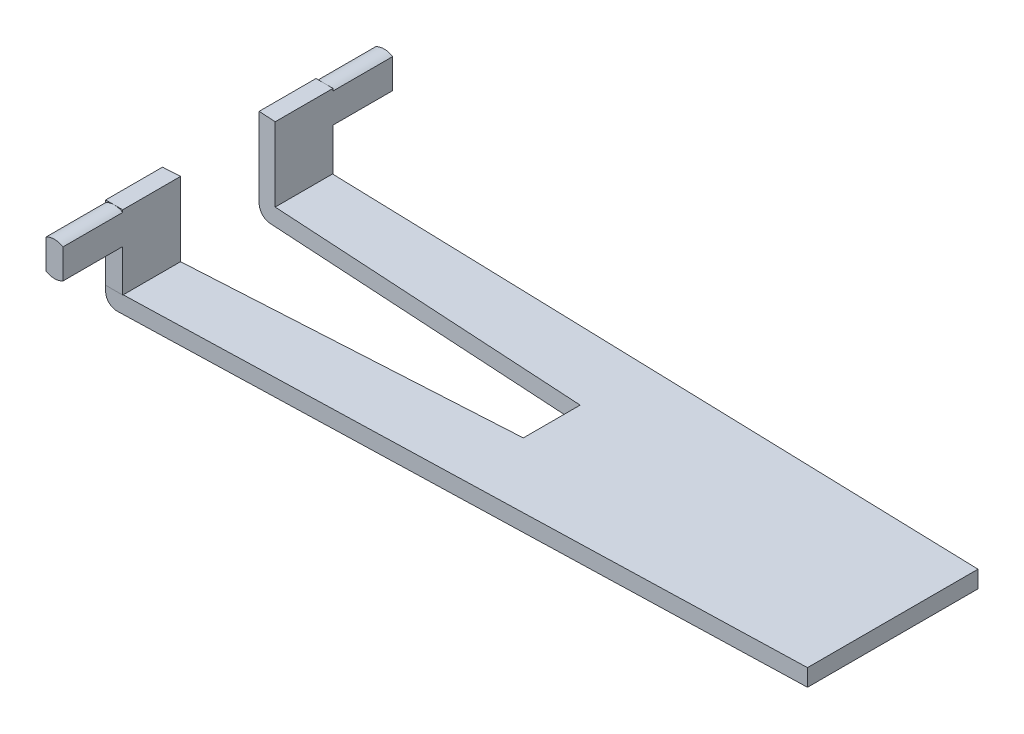
ISO-10303-21;
HEADER;
FILE_DESCRIPTION(('STEP AP214'),'2;1');
FILE_NAME('part.step','',(''),(''),'','','');
FILE_SCHEMA(('AUTOMOTIVE_DESIGN { 1 0 10303 214 1 1 1 1 }'));
ENDSEC;
DATA;
#1=APPLICATION_CONTEXT('core data for automotive mechanical design processes');
#2=APPLICATION_PROTOCOL_DEFINITION('international standard','automotive_design',2000,#1);
#3=PRODUCT_CONTEXT('',#1,'mechanical');
#4=PRODUCT('Part','Part','',(#3));
#5=PRODUCT_RELATED_PRODUCT_CATEGORY('part','',(#4));
#6=PRODUCT_DEFINITION_FORMATION('','',#4);
#7=PRODUCT_DEFINITION_CONTEXT('part definition',#1,'design');
#8=PRODUCT_DEFINITION('design','',#6,#7);
#9=PRODUCT_DEFINITION_SHAPE('','',#8);
#10=(LENGTH_UNIT() NAMED_UNIT(*) SI_UNIT(.MILLI.,.METRE.));
#11=(NAMED_UNIT(*) PLANE_ANGLE_UNIT() SI_UNIT($,.RADIAN.));
#12=(NAMED_UNIT(*) SI_UNIT($,.STERADIAN.) SOLID_ANGLE_UNIT());
#13=UNCERTAINTY_MEASURE_WITH_UNIT(LENGTH_MEASURE(1.E-05),#10,'distance_accuracy_value','');
#14=(GEOMETRIC_REPRESENTATION_CONTEXT(3) GLOBAL_UNCERTAINTY_ASSIGNED_CONTEXT((#13)) GLOBAL_UNIT_ASSIGNED_CONTEXT((#10,
#11,#12)) REPRESENTATION_CONTEXT('',''));
#15=CARTESIAN_POINT('',(0.,0.,0.));
#16=DIRECTION('',(0.,0.,1.));
#17=DIRECTION('',(1.,0.,0.));
#18=AXIS2_PLACEMENT_3D('',#15,#16,#17);
#19=CARTESIAN_POINT('',(-6.,0.3,1.84763326978969));
#20=DIRECTION('',(1.,0.,0.));
#21=DIRECTION('',(0.,0.,-1.));
#22=AXIS2_PLACEMENT_3D('',#19,#20,#21);
#23=PLANE('',#22);
#24=DIRECTION('',(0.,0.,1.));
#25=VECTOR('',#24,1.);
#26=CARTESIAN_POINT('',(-6.,1.55980762113533,1.84763326978969));
#27=LINE('',#26,#25);
#28=CARTESIAN_POINT('',(-6.,1.55980762113533,1.84763326978969));
#29=VERTEX_POINT('',#28);
#30=CARTESIAN_POINT('',(-6.,1.55980762113533,2.89763326978969));
#31=VERTEX_POINT('',#30);
#32=EDGE_CURVE('E221',#29,#31,#27,.T.);
#33=ORIENTED_EDGE('',*,*,#32,.F.);
#34=DIRECTION('',(0.,-1.,0.));
#35=VECTOR('',#34,1.);
#36=CARTESIAN_POINT('',(-6.,0.3,1.84763326978969));
#37=LINE('',#36,#35);
#38=CARTESIAN_POINT('',(-6.,1.6,1.84763326978969));
#39=VERTEX_POINT('',#38);
#40=EDGE_CURVE('E205',#39,#29,#37,.T.);
#41=ORIENTED_EDGE('',*,*,#40,.F.);
#42=DIRECTION('',(0.,0.,1.));
#43=VECTOR('',#42,1.);
#44=CARTESIAN_POINT('',(-6.,1.6,0.847633269789688));
#45=LINE('',#44,#43);
#46=CARTESIAN_POINT('',(-6.,1.6,0.847633269789688));
#47=VERTEX_POINT('',#46);
#48=EDGE_CURVE('E284',#47,#39,#45,.T.);
#49=ORIENTED_EDGE('',*,*,#48,.F.);
#50=DIRECTION('',(0.,-1.,0.));
#51=VECTOR('',#50,1.);
#52=CARTESIAN_POINT('',(-6.,0.3,0.847633269789688));
#53=LINE('',#52,#51);
#54=CARTESIAN_POINT('',(-6.,0.2,0.847633269789688));
#55=VERTEX_POINT('',#54);
#56=EDGE_CURVE('E361',#47,#55,#53,.T.);
#57=ORIENTED_EDGE('',*,*,#56,.T.);
#58=DIRECTION('',(0.,0.,1.));
#59=VECTOR('',#58,1.);
#60=CARTESIAN_POINT('',(-6.,0.2,1.84763326978969));
#61=LINE('',#60,#59);
#62=CARTESIAN_POINT('',(-6.,0.2,1.84763326978969));
#63=VERTEX_POINT('',#62);
#64=EDGE_CURVE('E371',#55,#63,#61,.T.);
#65=ORIENTED_EDGE('',*,*,#64,.T.);
#66=DIRECTION('',(0.,-1.,0.));
#67=VECTOR('',#66,1.);
#68=CARTESIAN_POINT('',(-6.,0.3,1.84763326978969));
#69=LINE('',#68,#67);
#70=CARTESIAN_POINT('',(-6.,0.3,1.84763326978969));
#71=VERTEX_POINT('',#70);
#72=EDGE_CURVE('E358',#71,#63,#69,.T.);
#73=ORIENTED_EDGE('',*,*,#72,.F.);
#74=DIRECTION('',(0.,-1.,0.));
#75=VECTOR('',#74,1.);
#76=CARTESIAN_POINT('',(-6.,0.3,1.84763326978969));
#77=LINE('',#76,#75);
#78=CARTESIAN_POINT('',(-6.,1.04019237886467,1.84763326978969));
#79=VERTEX_POINT('',#78);
#80=EDGE_CURVE('E268',#79,#71,#77,.T.);
#81=ORIENTED_EDGE('',*,*,#80,.F.);
#82=DIRECTION('',(0.,0.,1.));
#83=VECTOR('',#82,1.);
#84=CARTESIAN_POINT('',(-6.,1.04019237886467,1.84763326978969));
#85=LINE('',#84,#83);
#86=CARTESIAN_POINT('',(-6.,1.04019237886467,2.89763326978969));
#87=VERTEX_POINT('',#86);
#88=EDGE_CURVE('E229',#79,#87,#85,.T.);
#89=ORIENTED_EDGE('',*,*,#88,.T.);
#90=DIRECTION('',(0.,-1.,0.));
#91=VECTOR('',#90,1.);
#92=CARTESIAN_POINT('',(-6.,1.6,2.89763326978969));
#93=LINE('',#92,#91);
#94=EDGE_CURVE('E228',#31,#87,#93,.T.);
#95=ORIENTED_EDGE('',*,*,#94,.F.);
#96=EDGE_LOOP('',(#33,#41,#49,#57,#65,#73,#81,#89,#95));
#97=FACE_BOUND('',#96,.T.);
#98=ADVANCED_FACE('F37',(#97),#23,.F.);
#99=CARTESIAN_POINT('',(-6.,1.6,2.89763326978969));
#100=DIRECTION('',(0.,0.,-1.));
#101=DIRECTION('',(-1.,0.,0.));
#102=AXIS2_PLACEMENT_3D('',#99,#100,#101);
#103=PLANE('',#102);
#104=CARTESIAN_POINT('',(-5.85,1.3,2.89763326978969));
#105=DIRECTION('',(0.,0.,1.));
#106=DIRECTION('',(1.,0.,0.));
#107=AXIS2_PLACEMENT_3D('',#104,#105,#106);
#108=CIRCLE('',#107,0.3);
#109=CARTESIAN_POINT('',(-5.7,1.55980762113533,2.89763326978969));
#110=VERTEX_POINT('',#109);
#111=EDGE_CURVE('E446',#110,#31,#108,.T.);
#112=ORIENTED_EDGE('',*,*,#111,.T.);
#113=ORIENTED_EDGE('',*,*,#94,.T.);
#114=CARTESIAN_POINT('',(-5.85,1.3,2.89763326978969));
#115=DIRECTION('',(0.,0.,1.));
#116=DIRECTION('',(1.,0.,0.));
#117=AXIS2_PLACEMENT_3D('',#114,#115,#116);
#118=CIRCLE('',#117,0.3);
#119=CARTESIAN_POINT('',(-5.7,1.04019237886467,2.89763326978969));
#120=VERTEX_POINT('',#119);
#121=EDGE_CURVE('E224',#87,#120,#118,.T.);
#122=ORIENTED_EDGE('',*,*,#121,.T.);
#123=DIRECTION('',(0.,-1.,0.));
#124=VECTOR('',#123,1.);
#125=CARTESIAN_POINT('',(-5.7,1.6,2.89763326978969));
#126=LINE('',#125,#124);
#127=EDGE_CURVE('E294',#110,#120,#126,.T.);
#128=ORIENTED_EDGE('',*,*,#127,.F.);
#129=EDGE_LOOP('',(#112,#113,#122,#128));
#130=FACE_BOUND('',#129,.T.);
#131=ADVANCED_FACE('F445',(#130),#103,.F.);
#132=CARTESIAN_POINT('',(-5.7,1.6,2.89763326978969));
#133=DIRECTION('',(-1.,0.,0.));
#134=DIRECTION('',(0.,0.,1.));
#135=AXIS2_PLACEMENT_3D('',#132,#133,#134);
#136=PLANE('',#135);
#137=DIRECTION('',(0.,0.,1.));
#138=VECTOR('',#137,1.);
#139=CARTESIAN_POINT('',(-5.7,1.55980762113533,1.84763326978969));
#140=LINE('',#139,#138);
#141=CARTESIAN_POINT('',(-5.7,1.55980762113533,1.84763326978969));
#142=VERTEX_POINT('',#141);
#143=EDGE_CURVE('E241',#142,#110,#140,.T.);
#144=ORIENTED_EDGE('',*,*,#143,.T.);
#145=ORIENTED_EDGE('',*,*,#127,.T.);
#146=DIRECTION('',(0.,0.,1.));
#147=VECTOR('',#146,1.);
#148=CARTESIAN_POINT('',(-5.7,1.04019237886467,1.84763326978969));
#149=LINE('',#148,#147);
#150=CARTESIAN_POINT('',(-5.7,1.04019237886467,1.84763326978969));
#151=VERTEX_POINT('',#150);
#152=EDGE_CURVE('E232',#151,#120,#149,.T.);
#153=ORIENTED_EDGE('',*,*,#152,.F.);
#154=DIRECTION('',(0.,-1.,0.));
#155=VECTOR('',#154,1.);
#156=CARTESIAN_POINT('',(-5.7,0.3,1.84763326978969));
#157=LINE('',#156,#155);
#158=CARTESIAN_POINT('',(-5.7,0.3,1.84763326978969));
#159=VERTEX_POINT('',#158);
#160=EDGE_CURVE('E270',#151,#159,#157,.T.);
#161=ORIENTED_EDGE('',*,*,#160,.T.);
#162=DIRECTION('',(0.,0.,-1.));
#163=VECTOR('',#162,1.);
#164=CARTESIAN_POINT('',(-5.7,0.3,2.89763326978969));
#165=LINE('',#164,#163);
#166=CARTESIAN_POINT('',(-5.7,0.3,1.83894243804495));
#167=VERTEX_POINT('',#166);
#168=EDGE_CURVE('E285',#159,#167,#165,.T.);
#169=ORIENTED_EDGE('',*,*,#168,.T.);
#170=CARTESIAN_POINT('',(-5.7,0.3,0.830251606300204));
#171=VERTEX_POINT('',#170);
#172=EDGE_CURVE('E291',#167,#171,#165,.T.);
#173=ORIENTED_EDGE('',*,*,#172,.T.);
#174=DIRECTION('',(0.,-1.,0.));
#175=VECTOR('',#174,1.);
#176=CARTESIAN_POINT('',(-5.7,1.6,0.830251606300204));
#177=LINE('',#176,#175);
#178=CARTESIAN_POINT('',(-5.7,1.6,0.830251606300204));
#179=VERTEX_POINT('',#178);
#180=EDGE_CURVE('E289',#179,#171,#177,.T.);
#181=ORIENTED_EDGE('',*,*,#180,.F.);
#182=DIRECTION('',(0.,0.,-1.));
#183=VECTOR('',#182,1.);
#184=CARTESIAN_POINT('',(-5.7,1.6,2.89763326978969));
#185=LINE('',#184,#183);
#186=CARTESIAN_POINT('',(-5.7,1.6,1.84763326978969));
#187=VERTEX_POINT('',#186);
#188=EDGE_CURVE('E287',#187,#179,#185,.T.);
#189=ORIENTED_EDGE('',*,*,#188,.F.);
#190=DIRECTION('',(0.,1.,0.));
#191=VECTOR('',#190,1.);
#192=CARTESIAN_POINT('',(-5.7,1.6,1.84763326978969));
#193=LINE('',#192,#191);
#194=EDGE_CURVE('E52',#142,#187,#193,.T.);
#195=ORIENTED_EDGE('',*,*,#194,.F.);
#196=EDGE_LOOP('',(#144,#145,#153,#161,#169,#173,#181,#189,#195));
#197=FACE_BOUND('',#196,.T.);
#198=ADVANCED_FACE('F428',(#197),#136,.F.);
#199=CARTESIAN_POINT('',(0.,1.6,0.));
#200=DIRECTION('',(0.,1.,0.));
#201=DIRECTION('',(0.,0.,1.));
#202=AXIS2_PLACEMENT_3D('',#199,#200,#201);
#203=PLANE('',#202);
#204=ORIENTED_EDGE('',*,*,#48,.T.);
#205=DIRECTION('',(1.,0.,0.));
#206=VECTOR('',#205,1.);
#207=CARTESIAN_POINT('',(0.,1.6,1.84763326978969));
#208=LINE('',#207,#206);
#209=CARTESIAN_POINT('',(-5.85,1.6,1.84763326978969));
#210=VERTEX_POINT('',#209);
#211=EDGE_CURVE('E211',#39,#210,#208,.T.);
#212=ORIENTED_EDGE('',*,*,#211,.T.);
#213=EDGE_CURVE('E239',#210,#187,#208,.T.);
#214=ORIENTED_EDGE('',*,*,#213,.T.);
#215=ORIENTED_EDGE('',*,*,#188,.T.);
#216=DIRECTION('',(-0.998325757229834,0.,0.0578418745501789));
#217=VECTOR('',#216,1.);
#218=CARTESIAN_POINT('',(-5.7,1.6,0.830251606300204));
#219=LINE('',#218,#217);
#220=EDGE_CURVE('E281',#179,#47,#219,.T.);
#221=ORIENTED_EDGE('',*,*,#220,.T.);
#222=EDGE_LOOP('',(#204,#212,#214,#215,#221));
#223=FACE_BOUND('',#222,.T.);
#224=ADVANCED_FACE('F440',(#223),#203,.T.);
#225=CARTESIAN_POINT('',(-6.,0.3,-0.852366730210312));
#226=DIRECTION('',(1.,0.,0.));
#227=DIRECTION('',(0.,0.,-1.));
#228=AXIS2_PLACEMENT_3D('',#225,#226,#227);
#229=PLANE('',#228);
#230=DIRECTION('',(0.,0.,-1.));
#231=VECTOR('',#230,1.);
#232=CARTESIAN_POINT('',(-6.,1.55980762113533,-1.85236673021031));
#233=LINE('',#232,#231);
#234=CARTESIAN_POINT('',(-6.,1.55980762113533,-1.85236673021031));
#235=VERTEX_POINT('',#234);
#236=CARTESIAN_POINT('',(-6.,1.55980762113533,-2.90236673021031));
#237=VERTEX_POINT('',#236);
#238=EDGE_CURVE('E251',#235,#237,#233,.T.);
#239=ORIENTED_EDGE('',*,*,#238,.T.);
#240=DIRECTION('',(0.,-1.,0.));
#241=VECTOR('',#240,1.);
#242=CARTESIAN_POINT('',(-6.,1.6,-2.90236673021031));
#243=LINE('',#242,#241);
#244=CARTESIAN_POINT('',(-6.,1.04019237886467,-2.90236673021031));
#245=VERTEX_POINT('',#244);
#246=EDGE_CURVE('E308',#237,#245,#243,.T.);
#247=ORIENTED_EDGE('',*,*,#246,.T.);
#248=DIRECTION('',(0.,0.,-1.));
#249=VECTOR('',#248,1.);
#250=CARTESIAN_POINT('',(-6.,1.04019237886467,-1.85236673021031));
#251=LINE('',#250,#249);
#252=CARTESIAN_POINT('',(-6.,1.04019237886467,-1.85236673021031));
#253=VERTEX_POINT('',#252);
#254=EDGE_CURVE('E255',#253,#245,#251,.T.);
#255=ORIENTED_EDGE('',*,*,#254,.F.);
#256=DIRECTION('',(0.,1.,0.));
#257=VECTOR('',#256,1.);
#258=CARTESIAN_POINT('',(-6.,0.3,-1.85236673021031));
#259=LINE('',#258,#257);
#260=CARTESIAN_POINT('',(-6.,0.3,-1.85236673021031));
#261=VERTEX_POINT('',#260);
#262=EDGE_CURVE('E277',#261,#253,#259,.T.);
#263=ORIENTED_EDGE('',*,*,#262,.F.);
#264=DIRECTION('',(0.,-1.,0.));
#265=VECTOR('',#264,1.);
#266=CARTESIAN_POINT('',(-6.,0.3,-1.85236673021031));
#267=LINE('',#266,#265);
#268=CARTESIAN_POINT('',(-6.,0.2,-1.85236673021031));
#269=VERTEX_POINT('',#268);
#270=EDGE_CURVE('E333',#261,#269,#267,.T.);
#271=ORIENTED_EDGE('',*,*,#270,.T.);
#272=DIRECTION('',(0.,0.,1.));
#273=VECTOR('',#272,1.);
#274=CARTESIAN_POINT('',(-6.,0.2,-0.852366730210312));
#275=LINE('',#274,#273);
#276=CARTESIAN_POINT('',(-6.,0.2,-0.852366730210312));
#277=VERTEX_POINT('',#276);
#278=EDGE_CURVE('E391',#269,#277,#275,.T.);
#279=ORIENTED_EDGE('',*,*,#278,.T.);
#280=DIRECTION('',(0.,-1.,0.));
#281=VECTOR('',#280,1.);
#282=CARTESIAN_POINT('',(-6.,0.3,-0.852366730210312));
#283=LINE('',#282,#281);
#284=CARTESIAN_POINT('',(-6.,1.6,-0.852366730210312));
#285=VERTEX_POINT('',#284);
#286=EDGE_CURVE('E369',#285,#277,#283,.T.);
#287=ORIENTED_EDGE('',*,*,#286,.F.);
#288=DIRECTION('',(0.,0.,1.));
#289=VECTOR('',#288,1.);
#290=CARTESIAN_POINT('',(-6.,1.6,-0.852366730210312));
#291=LINE('',#290,#289);
#292=CARTESIAN_POINT('',(-6.,1.6,-1.85236673021031));
#293=VERTEX_POINT('',#292);
#294=EDGE_CURVE('E306',#293,#285,#291,.T.);
#295=ORIENTED_EDGE('',*,*,#294,.F.);
#296=DIRECTION('',(0.,1.,0.));
#297=VECTOR('',#296,1.);
#298=CARTESIAN_POINT('',(-6.,0.3,-1.85236673021031));
#299=LINE('',#298,#297);
#300=EDGE_CURVE('E265',#235,#293,#299,.T.);
#301=ORIENTED_EDGE('',*,*,#300,.F.);
#302=EDGE_LOOP('',(#239,#247,#255,#263,#271,#279,#287,#295,#301));
#303=FACE_BOUND('',#302,.T.);
#304=ADVANCED_FACE('F413',(#303),#229,.F.);
#305=CARTESIAN_POINT('',(-5.7,1.6,-2.90236673021031));
#306=DIRECTION('',(-1.,0.,0.));
#307=DIRECTION('',(0.,0.,1.));
#308=AXIS2_PLACEMENT_3D('',#305,#306,#307);
#309=PLANE('',#308);
#310=DIRECTION('',(0.,0.,-1.));
#311=VECTOR('',#310,1.);
#312=CARTESIAN_POINT('',(-5.7,1.55980762113533,-1.85236673021031));
#313=LINE('',#312,#311);
#314=CARTESIAN_POINT('',(-5.7,1.55980762113533,-1.85236673021031));
#315=VERTEX_POINT('',#314);
#316=CARTESIAN_POINT('',(-5.7,1.55980762113533,-2.90236673021031));
#317=VERTEX_POINT('',#316);
#318=EDGE_CURVE('E247',#315,#317,#313,.T.);
#319=ORIENTED_EDGE('',*,*,#318,.F.);
#320=DIRECTION('',(0.,-1.,0.));
#321=VECTOR('',#320,1.);
#322=CARTESIAN_POINT('',(-5.7,1.6,-1.85236673021031));
#323=LINE('',#322,#321);
#324=CARTESIAN_POINT('',(-5.7,1.6,-1.85236673021031));
#325=VERTEX_POINT('',#324);
#326=EDGE_CURVE('E263',#325,#315,#323,.T.);
#327=ORIENTED_EDGE('',*,*,#326,.F.);
#328=DIRECTION('',(0.,0.,-1.));
#329=VECTOR('',#328,1.);
#330=CARTESIAN_POINT('',(-5.7,1.6,-2.90236673021031));
#331=LINE('',#330,#329);
#332=CARTESIAN_POINT('',(-5.7,1.6,-0.834748393699796));
#333=VERTEX_POINT('',#332);
#334=EDGE_CURVE('E302',#333,#325,#331,.T.);
#335=ORIENTED_EDGE('',*,*,#334,.F.);
#336=DIRECTION('',(0.,-1.,0.));
#337=VECTOR('',#336,1.);
#338=CARTESIAN_POINT('',(-5.7,1.6,-0.834748393699796));
#339=LINE('',#338,#337);
#340=CARTESIAN_POINT('',(-5.7,0.3,-0.834748393699796));
#341=VERTEX_POINT('',#340);
#342=EDGE_CURVE('E320',#333,#341,#339,.T.);
#343=ORIENTED_EDGE('',*,*,#342,.T.);
#344=DIRECTION('',(0.,0.,-1.));
#345=VECTOR('',#344,1.);
#346=CARTESIAN_POINT('',(-5.7,0.3,-2.90236673021031));
#347=LINE('',#346,#345);
#348=CARTESIAN_POINT('',(-5.7,0.3,-1.84355756195505));
#349=VERTEX_POINT('',#348);
#350=EDGE_CURVE('E303',#341,#349,#347,.T.);
#351=ORIENTED_EDGE('',*,*,#350,.T.);
#352=CARTESIAN_POINT('',(-5.7,0.3,-1.85236673021031));
#353=VERTEX_POINT('',#352);
#354=EDGE_CURVE('E298',#349,#353,#347,.T.);
#355=ORIENTED_EDGE('',*,*,#354,.T.);
#356=DIRECTION('',(0.,1.,0.));
#357=VECTOR('',#356,1.);
#358=CARTESIAN_POINT('',(-5.7,0.3,-1.85236673021031));
#359=LINE('',#358,#357);
#360=CARTESIAN_POINT('',(-5.7,1.04019237886467,-1.85236673021031));
#361=VERTEX_POINT('',#360);
#362=EDGE_CURVE('E278',#353,#361,#359,.T.);
#363=ORIENTED_EDGE('',*,*,#362,.T.);
#364=DIRECTION('',(0.,0.,-1.));
#365=VECTOR('',#364,1.);
#366=CARTESIAN_POINT('',(-5.7,1.04019237886467,-1.85236673021031));
#367=LINE('',#366,#365);
#368=CARTESIAN_POINT('',(-5.7,1.04019237886467,-2.90236673021031));
#369=VERTEX_POINT('',#368);
#370=EDGE_CURVE('E258',#361,#369,#367,.T.);
#371=ORIENTED_EDGE('',*,*,#370,.T.);
#372=DIRECTION('',(0.,-1.,0.));
#373=VECTOR('',#372,1.);
#374=CARTESIAN_POINT('',(-5.7,1.6,-2.90236673021031));
#375=LINE('',#374,#373);
#376=EDGE_CURVE('E324',#317,#369,#375,.T.);
#377=ORIENTED_EDGE('',*,*,#376,.F.);
#378=EDGE_LOOP('',(#319,#327,#335,#343,#351,#355,#363,#371,#377));
#379=FACE_BOUND('',#378,.T.);
#380=ADVANCED_FACE('F480',(#379),#309,.F.);
#381=CARTESIAN_POINT('',(-6.,1.6,-2.90236673021031));
#382=DIRECTION('',(0.,0.,1.));
#383=DIRECTION('',(1.,0.,0.));
#384=AXIS2_PLACEMENT_3D('',#381,#382,#383);
#385=PLANE('',#384);
#386=CARTESIAN_POINT('',(-5.85,1.3,-2.90236673021031));
#387=DIRECTION('',(0.,0.,-1.));
#388=DIRECTION('',(-1.,0.,0.));
#389=AXIS2_PLACEMENT_3D('',#386,#387,#388);
#390=CIRCLE('',#389,0.3);
#391=EDGE_CURVE('E216',#237,#317,#390,.T.);
#392=ORIENTED_EDGE('',*,*,#391,.T.);
#393=ORIENTED_EDGE('',*,*,#376,.T.);
#394=CARTESIAN_POINT('',(-5.85,1.3,-2.90236673021031));
#395=DIRECTION('',(0.,0.,-1.));
#396=DIRECTION('',(-1.,0.,0.));
#397=AXIS2_PLACEMENT_3D('',#394,#395,#396);
#398=CIRCLE('',#397,0.3);
#399=EDGE_CURVE('E249',#369,#245,#398,.T.);
#400=ORIENTED_EDGE('',*,*,#399,.T.);
#401=ORIENTED_EDGE('',*,*,#246,.F.);
#402=EDGE_LOOP('',(#392,#393,#400,#401));
#403=FACE_BOUND('',#402,.T.);
#404=ADVANCED_FACE('F470',(#403),#385,.F.);
#405=CARTESIAN_POINT('',(0.,1.6,0.));
#406=DIRECTION('',(0.,-1.,0.));
#407=DIRECTION('',(0.,0.,-1.));
#408=AXIS2_PLACEMENT_3D('',#405,#406,#407);
#409=PLANE('',#408);
#410=DIRECTION('',(1.,0.,0.));
#411=VECTOR('',#410,1.);
#412=CARTESIAN_POINT('',(0.,1.6,-1.85236673021031));
#413=LINE('',#412,#411);
#414=CARTESIAN_POINT('',(-5.85,1.6,-1.85236673021031));
#415=VERTEX_POINT('',#414);
#416=EDGE_CURVE('E266',#293,#415,#413,.T.);
#417=ORIENTED_EDGE('',*,*,#416,.F.);
#418=ORIENTED_EDGE('',*,*,#294,.T.);
#419=DIRECTION('',(0.998279971383672,0.,0.0586267748918176));
#420=VECTOR('',#419,1.);
#421=CARTESIAN_POINT('',(-5.7,1.6,-0.834748393699796));
#422=LINE('',#421,#420);
#423=EDGE_CURVE('E299',#285,#333,#422,.T.);
#424=ORIENTED_EDGE('',*,*,#423,.T.);
#425=ORIENTED_EDGE('',*,*,#334,.T.);
#426=EDGE_CURVE('E254',#415,#325,#413,.T.);
#427=ORIENTED_EDGE('',*,*,#426,.F.);
#428=EDGE_LOOP('',(#417,#418,#424,#425,#427));
#429=FACE_BOUND('',#428,.T.);
#430=ADVANCED_FACE('F534',(#429),#409,.F.);
#431=CARTESIAN_POINT('',(0.,0.3,0.));
#432=DIRECTION('',(0.,-1.,0.));
#433=DIRECTION('',(0.,0.,-1.));
#434=AXIS2_PLACEMENT_3D('',#431,#432,#433);
#435=PLANE('',#434);
#436=ORIENTED_EDGE('',*,*,#172,.F.);
#437=DIRECTION('',(0.999580649727236,0.,-0.0289572908069317));
#438=VECTOR('',#437,1.);
#439=CARTESIAN_POINT('',(-6.,0.3,1.84763326978969));
#440=LINE('',#439,#438);
#441=CARTESIAN_POINT('',(6.,0.3,1.5));
#442=VERTEX_POINT('',#441);
#443=EDGE_CURVE('E460',#167,#442,#440,.T.);
#444=ORIENTED_EDGE('',*,*,#443,.T.);
#445=DIRECTION('',(0.,0.,-1.));
#446=VECTOR('',#445,1.);
#447=CARTESIAN_POINT('',(6.,0.3,1.5));
#448=LINE('',#447,#446);
#449=CARTESIAN_POINT('',(6.,0.3,-1.5));
#450=VERTEX_POINT('',#449);
#451=EDGE_CURVE('E332',#442,#450,#448,.T.);
#452=ORIENTED_EDGE('',*,*,#451,.T.);
#453=DIRECTION('',(-0.999569159454568,0.,-0.0293512430280063));
#454=VECTOR('',#453,1.);
#455=CARTESIAN_POINT('',(-6.,0.3,-1.85236673021031));
#456=LINE('',#455,#454);
#457=EDGE_CURVE('E331',#450,#349,#456,.T.);
#458=ORIENTED_EDGE('',*,*,#457,.T.);
#459=ORIENTED_EDGE('',*,*,#350,.F.);
#460=DIRECTION('',(0.998279971383672,0.,0.058626774891818));
#461=VECTOR('',#460,1.);
#462=CARTESIAN_POINT('',(-6.,0.3,-0.852366730210312));
#463=LINE('',#462,#461);
#464=CARTESIAN_POINT('',(0.,0.3,-0.5));
#465=VERTEX_POINT('',#464);
#466=EDGE_CURVE('E317',#341,#465,#463,.T.);
#467=ORIENTED_EDGE('',*,*,#466,.T.);
#468=DIRECTION('',(0.,0.,1.));
#469=VECTOR('',#468,1.);
#470=CARTESIAN_POINT('',(0.,0.3,-0.5));
#471=LINE('',#470,#469);
#472=CARTESIAN_POINT('',(0.,0.3,0.5));
#473=VERTEX_POINT('',#472);
#474=EDGE_CURVE('E463',#465,#473,#471,.T.);
#475=ORIENTED_EDGE('',*,*,#474,.T.);
#476=DIRECTION('',(-0.998325757229834,0.,0.057841874550179));
#477=VECTOR('',#476,1.);
#478=CARTESIAN_POINT('',(0.,0.3,0.5));
#479=LINE('',#478,#477);
#480=EDGE_CURVE('E438',#473,#171,#479,.T.);
#481=ORIENTED_EDGE('',*,*,#480,.T.);
#482=EDGE_LOOP('',(#436,#444,#452,#458,#459,#467,#475,#481));
#483=FACE_BOUND('',#482,.T.);
#484=ADVANCED_FACE('F483',(#483),#435,.F.);
#485=CARTESIAN_POINT('',(-6.,0.3,-0.852366730210312));
#486=DIRECTION('',(0.058626774891818,0.,-0.998279971383672));
#487=DIRECTION('',(-0.998279971383672,0.,-0.058626774891818));
#488=AXIS2_PLACEMENT_3D('',#485,#486,#487);
#489=PLANE('',#488);
#490=ORIENTED_EDGE('',*,*,#286,.T.);
#491=CARTESIAN_POINT('',(-5.8,0.2,-0.840621172536635));
#492=DIRECTION('',(0.058626774891818,0.,-0.998279971383672));
#493=DIRECTION('',(-0.998279971383672,0.,-0.058626774891818));
#494=AXIS2_PLACEMENT_3D('',#491,#492,#493);
#495=ELLIPSE('',#494,0.200344598442448,0.2);
#496=CARTESIAN_POINT('',(-5.8,0.,-0.840621172536635));
#497=VERTEX_POINT('',#496);
#498=EDGE_CURVE('E45',#277,#497,#495,.F.);
#499=ORIENTED_EDGE('',*,*,#498,.T.);
#500=DIRECTION('',(0.998279971383672,0.,0.058626774891818));
#501=VECTOR('',#500,1.);
#502=CARTESIAN_POINT('',(-6.,0.,-0.852366730210312));
#503=LINE('',#502,#501);
#504=CARTESIAN_POINT('',(0.,0.,-0.5));
#505=VERTEX_POINT('',#504);
#506=EDGE_CURVE('E323',#497,#505,#503,.T.);
#507=ORIENTED_EDGE('',*,*,#506,.T.);
#508=DIRECTION('',(0.,-1.,0.));
#509=VECTOR('',#508,1.);
#510=CARTESIAN_POINT('',(0.,0.3,-0.5));
#511=LINE('',#510,#509);
#512=EDGE_CURVE('E367',#465,#505,#511,.T.);
#513=ORIENTED_EDGE('',*,*,#512,.F.);
#514=ORIENTED_EDGE('',*,*,#466,.F.);
#515=ORIENTED_EDGE('',*,*,#342,.F.);
#516=ORIENTED_EDGE('',*,*,#423,.F.);
#517=EDGE_LOOP('',(#490,#499,#507,#513,#514,#515,#516));
#518=FACE_BOUND('',#517,.T.);
#519=ADVANCED_FACE('F394',(#518),#489,.F.);
#520=CARTESIAN_POINT('',(0.,0.3,-0.5));
#521=DIRECTION('',(1.,0.,0.));
#522=DIRECTION('',(0.,0.,-1.));
#523=AXIS2_PLACEMENT_3D('',#520,#521,#522);
#524=PLANE('',#523);
#525=DIRECTION('',(0.,0.,1.));
#526=VECTOR('',#525,1.);
#527=CARTESIAN_POINT('',(0.,0.,-0.5));
#528=LINE('',#527,#526);
#529=CARTESIAN_POINT('',(0.,0.,0.5));
#530=VERTEX_POINT('',#529);
#531=EDGE_CURVE('E340',#505,#530,#528,.T.);
#532=ORIENTED_EDGE('',*,*,#531,.T.);
#533=DIRECTION('',(0.,-1.,0.));
#534=VECTOR('',#533,1.);
#535=CARTESIAN_POINT('',(0.,0.3,0.5));
#536=LINE('',#535,#534);
#537=EDGE_CURVE('E364',#473,#530,#536,.T.);
#538=ORIENTED_EDGE('',*,*,#537,.F.);
#539=ORIENTED_EDGE('',*,*,#474,.F.);
#540=ORIENTED_EDGE('',*,*,#512,.T.);
#541=EDGE_LOOP('',(#532,#538,#539,#540));
#542=FACE_BOUND('',#541,.T.);
#543=ADVANCED_FACE('F488',(#542),#524,.F.);
#544=CARTESIAN_POINT('',(0.,0.3,0.5));
#545=DIRECTION('',(0.057841874550179,0.,0.998325757229834));
#546=DIRECTION('',(0.998325757229834,0.,-0.057841874550179));
#547=AXIS2_PLACEMENT_3D('',#544,#545,#546);
#548=PLANE('',#547);
#549=DIRECTION('',(-0.998325757229834,0.,0.057841874550179));
#550=VECTOR('',#549,1.);
#551=CARTESIAN_POINT('',(0.,0.,0.5));
#552=LINE('',#551,#550);
#553=CARTESIAN_POINT('',(-5.8,0.,0.836045494130032));
#554=VERTEX_POINT('',#553);
#555=EDGE_CURVE('E342',#530,#554,#552,.T.);
#556=ORIENTED_EDGE('',*,*,#555,.T.);
#557=CARTESIAN_POINT('',(-5.8,0.2,0.836045494130032));
#558=DIRECTION('',(0.057841874550179,0.,0.998325757229834));
#559=DIRECTION('',(0.998325757229834,0.,-0.057841874550179));
#560=AXIS2_PLACEMENT_3D('',#557,#558,#559);
#561=ELLIPSE('',#560,0.200335410111988,0.2);
#562=EDGE_CURVE('E389',#554,#55,#561,.F.);
#563=ORIENTED_EDGE('',*,*,#562,.T.);
#564=ORIENTED_EDGE('',*,*,#56,.F.);
#565=ORIENTED_EDGE('',*,*,#220,.F.);
#566=ORIENTED_EDGE('',*,*,#180,.T.);
#567=ORIENTED_EDGE('',*,*,#480,.F.);
#568=ORIENTED_EDGE('',*,*,#537,.T.);
#569=EDGE_LOOP('',(#556,#563,#564,#565,#566,#567,#568));
#570=FACE_BOUND('',#569,.T.);
#571=ADVANCED_FACE('F437',(#570),#548,.F.);
#572=CARTESIAN_POINT('',(-6.,0.3,1.84763326978969));
#573=DIRECTION('',(-0.0289572908069317,0.,-0.999580649727236));
#574=DIRECTION('',(-0.999580649727236,0.,0.0289572908069317));
#575=AXIS2_PLACEMENT_3D('',#572,#573,#574);
#576=PLANE('',#575);
#577=ORIENTED_EDGE('',*,*,#72,.T.);
#578=CARTESIAN_POINT('',(-5.8,0.2,1.84183938195986));
#579=DIRECTION('',(-0.0289572908069317,0.,-0.999580649727236));
#580=DIRECTION('',(0.999580649727236,0.,-0.0289572908069317));
#581=AXIS2_PLACEMENT_3D('',#578,#579,#580);
#582=ELLIPSE('',#581,0.200083905240238,0.2);
#583=CARTESIAN_POINT('',(-5.8,0.,1.84183938195986));
#584=VERTEX_POINT('',#583);
#585=EDGE_CURVE('E376',#63,#584,#582,.F.);
#586=ORIENTED_EDGE('',*,*,#585,.T.);
#587=DIRECTION('',(0.999580649727236,0.,-0.0289572908069317));
#588=VECTOR('',#587,1.);
#589=CARTESIAN_POINT('',(-6.,0.,1.84763326978969));
#590=LINE('',#589,#588);
#591=CARTESIAN_POINT('',(6.,0.,1.5));
#592=VERTEX_POINT('',#591);
#593=EDGE_CURVE('E345',#584,#592,#590,.T.);
#594=ORIENTED_EDGE('',*,*,#593,.T.);
#595=DIRECTION('',(0.,-1.,0.));
#596=VECTOR('',#595,1.);
#597=CARTESIAN_POINT('',(6.,0.3,1.5));
#598=LINE('',#597,#596);
#599=EDGE_CURVE('E355',#442,#592,#598,.T.);
#600=ORIENTED_EDGE('',*,*,#599,.F.);
#601=ORIENTED_EDGE('',*,*,#443,.F.);
#602=EDGE_CURVE('E458',#71,#167,#440,.T.);
#603=ORIENTED_EDGE('',*,*,#602,.F.);
#604=EDGE_LOOP('',(#577,#586,#594,#600,#601,#603));
#605=FACE_BOUND('',#604,.T.);
#606=ADVANCED_FACE('F494',(#605),#576,.F.);
#607=CARTESIAN_POINT('',(6.,0.3,1.5));
#608=DIRECTION('',(-1.,0.,0.));
#609=DIRECTION('',(0.,0.,1.));
#610=AXIS2_PLACEMENT_3D('',#607,#608,#609);
#611=PLANE('',#610);
#612=DIRECTION('',(0.,0.,-1.));
#613=VECTOR('',#612,1.);
#614=CARTESIAN_POINT('',(6.,0.,1.5));
#615=LINE('',#614,#613);
#616=CARTESIAN_POINT('',(6.,0.,-1.5));
#617=VERTEX_POINT('',#616);
#618=EDGE_CURVE('E347',#592,#617,#615,.T.);
#619=ORIENTED_EDGE('',*,*,#618,.T.);
#620=DIRECTION('',(0.,-1.,0.));
#621=VECTOR('',#620,1.);
#622=CARTESIAN_POINT('',(6.,0.3,-1.5));
#623=LINE('',#622,#621);
#624=EDGE_CURVE('E352',#450,#617,#623,.T.);
#625=ORIENTED_EDGE('',*,*,#624,.F.);
#626=ORIENTED_EDGE('',*,*,#451,.F.);
#627=ORIENTED_EDGE('',*,*,#599,.T.);
#628=EDGE_LOOP('',(#619,#625,#626,#627));
#629=FACE_BOUND('',#628,.T.);
#630=ADVANCED_FACE('F547',(#629),#611,.F.);
#631=CARTESIAN_POINT('',(-6.,0.3,-1.85236673021031));
#632=DIRECTION('',(-0.0293512430280063,0.,0.999569159454568));
#633=DIRECTION('',(0.999569159454568,0.,0.0293512430280063));
#634=AXIS2_PLACEMENT_3D('',#631,#632,#633);
#635=PLANE('',#634);
#636=DIRECTION('',(-0.999569159454568,0.,-0.0293512430280063));
#637=VECTOR('',#636,1.);
#638=CARTESIAN_POINT('',(-6.,0.,-1.85236673021031));
#639=LINE('',#638,#637);
#640=CARTESIAN_POINT('',(-5.8,0.,-1.84649395137347));
#641=VERTEX_POINT('',#640);
#642=EDGE_CURVE('E349',#617,#641,#639,.T.);
#643=ORIENTED_EDGE('',*,*,#642,.T.);
#644=CARTESIAN_POINT('',(-5.8,0.2,-1.84649395137347));
#645=DIRECTION('',(-0.0293512430280063,0.,0.999569159454568));
#646=DIRECTION('',(-0.999569159454568,0.,-0.0293512430280063));
#647=AXIS2_PLACEMENT_3D('',#644,#645,#646);
#648=ELLIPSE('',#647,0.200086205249803,0.2);
#649=EDGE_CURVE('E12',#641,#269,#648,.F.);
#650=ORIENTED_EDGE('',*,*,#649,.T.);
#651=ORIENTED_EDGE('',*,*,#270,.F.);
#652=EDGE_CURVE('E327',#349,#261,#456,.T.);
#653=ORIENTED_EDGE('',*,*,#652,.F.);
#654=ORIENTED_EDGE('',*,*,#457,.F.);
#655=ORIENTED_EDGE('',*,*,#624,.T.);
#656=EDGE_LOOP('',(#643,#650,#651,#653,#654,#655));
#657=FACE_BOUND('',#656,.T.);
#658=ADVANCED_FACE('F409',(#657),#635,.F.);
#659=CARTESIAN_POINT('',(0.,0.,0.));
#660=DIRECTION('',(0.,-1.,0.));
#661=DIRECTION('',(0.,0.,-1.));
#662=AXIS2_PLACEMENT_3D('',#659,#660,#661);
#663=PLANE('',#662);
#664=ORIENTED_EDGE('',*,*,#593,.F.);
#665=DIRECTION('',(0.,0.,1.));
#666=VECTOR('',#665,1.);
#667=CARTESIAN_POINT('',(-5.8,0.,0.847633269789688));
#668=LINE('',#667,#666);
#669=EDGE_CURVE('E387',#584,#554,#668,.F.);
#670=ORIENTED_EDGE('',*,*,#669,.T.);
#671=ORIENTED_EDGE('',*,*,#555,.F.);
#672=ORIENTED_EDGE('',*,*,#531,.F.);
#673=ORIENTED_EDGE('',*,*,#506,.F.);
#674=DIRECTION('',(0.,0.,1.));
#675=VECTOR('',#674,1.);
#676=CARTESIAN_POINT('',(-5.8,0.,-1.85236673021031));
#677=LINE('',#676,#675);
#678=EDGE_CURVE('E380',#497,#641,#677,.F.);
#679=ORIENTED_EDGE('',*,*,#678,.T.);
#680=ORIENTED_EDGE('',*,*,#642,.F.);
#681=ORIENTED_EDGE('',*,*,#618,.F.);
#682=EDGE_LOOP('',(#664,#670,#671,#672,#673,#679,#680,#681));
#683=FACE_BOUND('',#682,.T.);
#684=ADVANCED_FACE('F402',(#683),#663,.T.);
#685=CARTESIAN_POINT('',(0.,0.3,0.));
#686=DIRECTION('',(0.,-1.,0.));
#687=DIRECTION('',(0.,0.,-1.));
#688=AXIS2_PLACEMENT_3D('',#685,#686,#687);
#689=PLANE('',#688);
#690=DIRECTION('',(-1.,0.,0.));
#691=VECTOR('',#690,1.);
#692=CARTESIAN_POINT('',(-5.7,0.3,-1.85236673021031));
#693=LINE('',#692,#691);
#694=EDGE_CURVE('E280',#353,#261,#693,.T.);
#695=ORIENTED_EDGE('',*,*,#694,.F.);
#696=ORIENTED_EDGE('',*,*,#354,.F.);
#697=ORIENTED_EDGE('',*,*,#652,.T.);
#698=EDGE_LOOP('',(#695,#696,#697));
#699=FACE_BOUND('',#698,.T.);
#700=ADVANCED_FACE('F478',(#699),#689,.T.);
#701=CARTESIAN_POINT('',(0.,0.3,0.));
#702=DIRECTION('',(0.,1.,0.));
#703=DIRECTION('',(0.,0.,1.));
#704=AXIS2_PLACEMENT_3D('',#701,#702,#703);
#705=PLANE('',#704);
#706=ORIENTED_EDGE('',*,*,#168,.F.);
#707=DIRECTION('',(-1.,0.,0.));
#708=VECTOR('',#707,1.);
#709=CARTESIAN_POINT('',(-5.7,0.3,1.84763326978969));
#710=LINE('',#709,#708);
#711=EDGE_CURVE('E273',#159,#71,#710,.T.);
#712=ORIENTED_EDGE('',*,*,#711,.T.);
#713=ORIENTED_EDGE('',*,*,#602,.T.);
#714=EDGE_LOOP('',(#706,#712,#713));
#715=FACE_BOUND('',#714,.T.);
#716=ADVANCED_FACE('F456',(#715),#705,.F.);
#717=CARTESIAN_POINT('',(-5.7,0.3,-1.85236673021031));
#718=DIRECTION('',(0.,0.,1.));
#719=DIRECTION('',(1.,0.,0.));
#720=AXIS2_PLACEMENT_3D('',#717,#718,#719);
#721=PLANE('',#720);
#722=ORIENTED_EDGE('',*,*,#262,.T.);
#723=CARTESIAN_POINT('',(-5.85,1.3,-1.85236673021031));
#724=DIRECTION('',(0.,0.,-1.));
#725=DIRECTION('',(-1.,0.,0.));
#726=AXIS2_PLACEMENT_3D('',#723,#724,#725);
#727=CIRCLE('',#726,0.3);
#728=EDGE_CURVE('E243',#361,#253,#727,.T.);
#729=ORIENTED_EDGE('',*,*,#728,.F.);
#730=ORIENTED_EDGE('',*,*,#362,.F.);
#731=ORIENTED_EDGE('',*,*,#694,.T.);
#732=EDGE_LOOP('',(#722,#729,#730,#731));
#733=FACE_BOUND('',#732,.T.);
#734=ADVANCED_FACE('F474',(#733),#721,.F.);
#735=CARTESIAN_POINT('',(-5.7,0.3,1.84763326978969));
#736=DIRECTION('',(0.,0.,-1.));
#737=DIRECTION('',(-1.,0.,0.));
#738=AXIS2_PLACEMENT_3D('',#735,#736,#737);
#739=PLANE('',#738);
#740=ORIENTED_EDGE('',*,*,#80,.T.);
#741=ORIENTED_EDGE('',*,*,#711,.F.);
#742=ORIENTED_EDGE('',*,*,#160,.F.);
#743=CARTESIAN_POINT('',(-5.85,1.3,1.84763326978969));
#744=DIRECTION('',(0.,0.,1.));
#745=DIRECTION('',(1.,0.,0.));
#746=AXIS2_PLACEMENT_3D('',#743,#744,#745);
#747=CIRCLE('',#746,0.3);
#748=EDGE_CURVE('E230',#79,#151,#747,.T.);
#749=ORIENTED_EDGE('',*,*,#748,.F.);
#750=EDGE_LOOP('',(#740,#741,#742,#749));
#751=FACE_BOUND('',#750,.T.);
#752=ADVANCED_FACE('F496',(#751),#739,.F.);
#753=CARTESIAN_POINT('',(-5.8,0.2,1.84763326978969));
#754=DIRECTION('',(0.,0.,-1.));
#755=DIRECTION('',(-1.,0.,0.));
#756=AXIS2_PLACEMENT_3D('',#753,#754,#755);
#757=CYLINDRICAL_SURFACE('',#756,0.2);
#758=ORIENTED_EDGE('',*,*,#562,.F.);
#759=ORIENTED_EDGE('',*,*,#669,.F.);
#760=ORIENTED_EDGE('',*,*,#585,.F.);
#761=ORIENTED_EDGE('',*,*,#64,.F.);
#762=EDGE_LOOP('',(#758,#759,#760,#761));
#763=FACE_BOUND('',#762,.T.);
#764=ADVANCED_FACE('F493',(#763),#757,.T.);
#765=CARTESIAN_POINT('',(-5.8,0.2,-0.852366730210312));
#766=DIRECTION('',(0.,0.,-1.));
#767=DIRECTION('',(-1.,0.,0.));
#768=AXIS2_PLACEMENT_3D('',#765,#766,#767);
#769=CYLINDRICAL_SURFACE('',#768,0.2);
#770=ORIENTED_EDGE('',*,*,#649,.F.);
#771=ORIENTED_EDGE('',*,*,#678,.F.);
#772=ORIENTED_EDGE('',*,*,#498,.F.);
#773=ORIENTED_EDGE('',*,*,#278,.F.);
#774=EDGE_LOOP('',(#770,#771,#772,#773));
#775=FACE_BOUND('',#774,.T.);
#776=ADVANCED_FACE('F39',(#775),#769,.T.);
#777=CARTESIAN_POINT('',(-5.85,1.3,-1.85236673021031));
#778=DIRECTION('',(0.,0.,-1.));
#779=DIRECTION('',(-1.,0.,0.));
#780=AXIS2_PLACEMENT_3D('',#777,#778,#779);
#781=CYLINDRICAL_SURFACE('',#780,0.3);
#782=ORIENTED_EDGE('',*,*,#728,.T.);
#783=ORIENTED_EDGE('',*,*,#254,.T.);
#784=ORIENTED_EDGE('',*,*,#399,.F.);
#785=ORIENTED_EDGE('',*,*,#370,.F.);
#786=EDGE_LOOP('',(#782,#783,#784,#785));
#787=FACE_BOUND('',#786,.T.);
#788=ADVANCED_FACE('F473',(#787),#781,.T.);
#789=CARTESIAN_POINT('',(-5.85,1.3,-1.85236673021031));
#790=DIRECTION('',(0.,0.,-1.));
#791=DIRECTION('',(-1.,0.,0.));
#792=AXIS2_PLACEMENT_3D('',#789,#790,#791);
#793=CYLINDRICAL_SURFACE('',#792,0.3);
#794=CARTESIAN_POINT('',(-5.85,1.3,-1.85236673021031));
#795=DIRECTION('',(0.,0.,-1.));
#796=DIRECTION('',(-1.,0.,0.));
#797=AXIS2_PLACEMENT_3D('',#794,#795,#796);
#798=CIRCLE('',#797,0.3);
#799=EDGE_CURVE('E60',#235,#415,#798,.T.);
#800=ORIENTED_EDGE('',*,*,#799,.T.);
#801=EDGE_CURVE('E244',#415,#315,#798,.T.);
#802=ORIENTED_EDGE('',*,*,#801,.T.);
#803=ORIENTED_EDGE('',*,*,#318,.T.);
#804=ORIENTED_EDGE('',*,*,#391,.F.);
#805=ORIENTED_EDGE('',*,*,#238,.F.);
#806=EDGE_LOOP('',(#800,#802,#803,#804,#805));
#807=FACE_BOUND('',#806,.T.);
#808=ADVANCED_FACE('F713',(#807),#793,.T.);
#809=CARTESIAN_POINT('',(-2.49999999998515E-05,0.8000125,-1.85236673021031));
#810=DIRECTION('',(0.,0.,-1.));
#811=DIRECTION('',(-1.,0.,0.));
#812=AXIS2_PLACEMENT_3D('',#809,#810,#811);
#813=PLANE('',#812);
#814=ORIENTED_EDGE('',*,*,#300,.T.);
#815=ORIENTED_EDGE('',*,*,#416,.T.);
#816=ORIENTED_EDGE('',*,*,#799,.F.);
#817=EDGE_LOOP('',(#814,#815,#816));
#818=FACE_BOUND('',#817,.T.);
#819=ADVANCED_FACE('F706',(#818),#813,.T.);
#820=ORIENTED_EDGE('',*,*,#326,.T.);
#821=ORIENTED_EDGE('',*,*,#801,.F.);
#822=ORIENTED_EDGE('',*,*,#426,.T.);
#823=EDGE_LOOP('',(#820,#821,#822));
#824=FACE_BOUND('',#823,.T.);
#825=ADVANCED_FACE('F675',(#824),#813,.T.);
#826=CARTESIAN_POINT('',(-5.85,1.3,1.84763326978969));
#827=DIRECTION('',(0.,0.,1.));
#828=DIRECTION('',(1.,0.,0.));
#829=AXIS2_PLACEMENT_3D('',#826,#827,#828);
#830=CYLINDRICAL_SURFACE('',#829,0.3);
#831=ORIENTED_EDGE('',*,*,#748,.T.);
#832=ORIENTED_EDGE('',*,*,#152,.T.);
#833=ORIENTED_EDGE('',*,*,#121,.F.);
#834=ORIENTED_EDGE('',*,*,#88,.F.);
#835=EDGE_LOOP('',(#831,#832,#833,#834));
#836=FACE_BOUND('',#835,.T.);
#837=ADVANCED_FACE('F451',(#836),#830,.T.);
#838=CARTESIAN_POINT('',(-5.85,1.3,1.84763326978969));
#839=DIRECTION('',(0.,0.,1.));
#840=DIRECTION('',(1.,0.,0.));
#841=AXIS2_PLACEMENT_3D('',#838,#839,#840);
#842=CYLINDRICAL_SURFACE('',#841,0.3);
#843=CARTESIAN_POINT('',(-5.85,1.3,1.84763326978969));
#844=DIRECTION('',(0.,0.,1.));
#845=DIRECTION('',(1.,0.,0.));
#846=AXIS2_PLACEMENT_3D('',#843,#844,#845);
#847=CIRCLE('',#846,0.3);
#848=EDGE_CURVE('E223',#142,#210,#847,.T.);
#849=ORIENTED_EDGE('',*,*,#848,.T.);
#850=EDGE_CURVE('E208',#210,#29,#847,.T.);
#851=ORIENTED_EDGE('',*,*,#850,.T.);
#852=ORIENTED_EDGE('',*,*,#32,.T.);
#853=ORIENTED_EDGE('',*,*,#111,.F.);
#854=ORIENTED_EDGE('',*,*,#143,.F.);
#855=EDGE_LOOP('',(#849,#851,#852,#853,#854));
#856=FACE_BOUND('',#855,.T.);
#857=ADVANCED_FACE('F220',(#856),#842,.T.);
#858=CARTESIAN_POINT('',(-2.49999999998515E-05,0.8000125,1.84763326978969));
#859=DIRECTION('',(0.,0.,1.));
#860=DIRECTION('',(1.,0.,0.));
#861=AXIS2_PLACEMENT_3D('',#858,#859,#860);
#862=PLANE('',#861);
#863=ORIENTED_EDGE('',*,*,#40,.T.);
#864=ORIENTED_EDGE('',*,*,#850,.F.);
#865=ORIENTED_EDGE('',*,*,#211,.F.);
#866=EDGE_LOOP('',(#863,#864,#865));
#867=FACE_BOUND('',#866,.T.);
#868=ADVANCED_FACE('F207',(#867),#862,.T.);
#869=ORIENTED_EDGE('',*,*,#194,.T.);
#870=ORIENTED_EDGE('',*,*,#213,.F.);
#871=ORIENTED_EDGE('',*,*,#848,.F.);
#872=EDGE_LOOP('',(#869,#870,#871));
#873=FACE_BOUND('',#872,.T.);
#874=ADVANCED_FACE('F690',(#873),#862,.T.);
#875=CLOSED_SHELL('',(#98,#131,#198,#224,#304,#380,#404,#430,#484,#519,#543,#571,#606,#630,#658,
#684,#700,#716,#734,#752,#764,#776,#788,#808,#819,#825,#837,#857,#868,#874));
#876=MANIFOLD_SOLID_BREP('B2',#875);
#877=ADVANCED_BREP_SHAPE_REPRESENTATION('',(#18,#876),#14);
#878=SHAPE_DEFINITION_REPRESENTATION(#9,#877);
ENDSEC;
END-ISO-10303-21;
